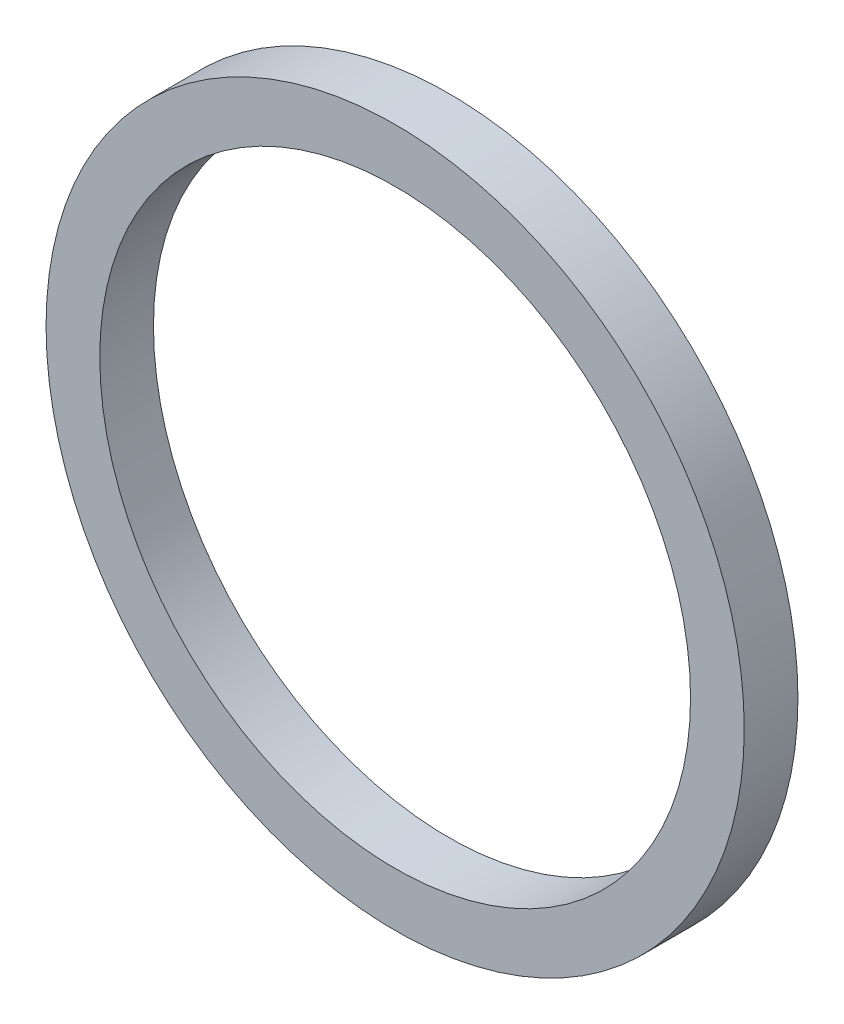
ISO-10303-21;
HEADER;
FILE_DESCRIPTION(('STEP AP214'),'2;1');
FILE_NAME('part.step','',(''),(''),'','','');
FILE_SCHEMA(('AUTOMOTIVE_DESIGN { 1 0 10303 214 1 1 1 1 }'));
ENDSEC;
DATA;
#1=APPLICATION_CONTEXT('core data for automotive mechanical design processes');
#2=APPLICATION_PROTOCOL_DEFINITION('international standard','automotive_design',2000,#1);
#3=PRODUCT_CONTEXT('',#1,'mechanical');
#4=PRODUCT('Part','Part','',(#3));
#5=PRODUCT_RELATED_PRODUCT_CATEGORY('part','',(#4));
#6=PRODUCT_DEFINITION_FORMATION('','',#4);
#7=PRODUCT_DEFINITION_CONTEXT('part definition',#1,'design');
#8=PRODUCT_DEFINITION('design','',#6,#7);
#9=PRODUCT_DEFINITION_SHAPE('','',#8);
#10=(LENGTH_UNIT() NAMED_UNIT(*) SI_UNIT(.MILLI.,.METRE.));
#11=(NAMED_UNIT(*) PLANE_ANGLE_UNIT() SI_UNIT($,.RADIAN.));
#12=(NAMED_UNIT(*) SI_UNIT($,.STERADIAN.) SOLID_ANGLE_UNIT());
#13=UNCERTAINTY_MEASURE_WITH_UNIT(LENGTH_MEASURE(1.E-05),#10,'distance_accuracy_value','');
#14=(GEOMETRIC_REPRESENTATION_CONTEXT(3) GLOBAL_UNCERTAINTY_ASSIGNED_CONTEXT((#13)) GLOBAL_UNIT_ASSIGNED_CONTEXT((#10,
#11,#12)) REPRESENTATION_CONTEXT('',''));
#15=CARTESIAN_POINT('',(0.,0.,0.));
#16=DIRECTION('',(0.,0.,1.));
#17=DIRECTION('',(1.,0.,0.));
#18=AXIS2_PLACEMENT_3D('',#15,#16,#17);
#19=CARTESIAN_POINT('',(0.,0.,2.5));
#20=DIRECTION('',(0.,0.,-1.));
#21=DIRECTION('',(-1.,0.,0.));
#22=AXIS2_PLACEMENT_3D('',#19,#20,#21);
#23=CYLINDRICAL_SURFACE('',#22,32.5);
#24=CARTESIAN_POINT('',(0.,0.,2.5));
#25=DIRECTION('',(0.,0.,1.));
#26=DIRECTION('',(1.,0.,0.));
#27=AXIS2_PLACEMENT_3D('',#24,#25,#26);
#28=CIRCLE('',#27,32.5);
#29=CARTESIAN_POINT('',(32.5,0.,2.5));
#30=VERTEX_POINT('',#29);
#31=EDGE_CURVE('E10',#30,#30,#28,.T.);
#32=ORIENTED_EDGE('',*,*,#31,.F.);
#33=EDGE_LOOP('',(#32));
#34=FACE_BOUND('',#33,.T.);
#35=CARTESIAN_POINT('',(0.,0.,-2.5));
#36=DIRECTION('',(0.,0.,1.));
#37=DIRECTION('',(1.,0.,0.));
#38=AXIS2_PLACEMENT_3D('',#35,#36,#37);
#39=CIRCLE('',#38,32.5);
#40=CARTESIAN_POINT('',(32.5,0.,-2.5));
#41=VERTEX_POINT('',#40);
#42=EDGE_CURVE('E40',#41,#41,#39,.T.);
#43=ORIENTED_EDGE('',*,*,#42,.T.);
#44=EDGE_LOOP('',(#43));
#45=FACE_BOUND('',#44,.T.);
#46=ADVANCED_FACE('F37',(#34,#45),#23,.T.);
#47=CARTESIAN_POINT('',(0.,0.,2.5));
#48=DIRECTION('',(0.,0.,1.));
#49=DIRECTION('',(1.,0.,0.));
#50=AXIS2_PLACEMENT_3D('',#47,#48,#49);
#51=PLANE('',#50);
#52=CARTESIAN_POINT('',(0.,0.,2.5));
#53=DIRECTION('',(0.,0.,1.));
#54=DIRECTION('',(1.,0.,0.));
#55=AXIS2_PLACEMENT_3D('',#52,#53,#54);
#56=CIRCLE('',#55,27.5);
#57=CARTESIAN_POINT('',(27.5,0.,2.5));
#58=VERTEX_POINT('',#57);
#59=EDGE_CURVE('E51',#58,#58,#56,.T.);
#60=ORIENTED_EDGE('',*,*,#59,.F.);
#61=EDGE_LOOP('',(#60));
#62=FACE_BOUND('',#61,.T.);
#63=ORIENTED_EDGE('',*,*,#31,.T.);
#64=EDGE_LOOP('',(#63));
#65=FACE_BOUND('',#64,.T.);
#66=ADVANCED_FACE('F68',(#62,#65),#51,.T.);
#67=CARTESIAN_POINT('',(0.,0.,-2.5));
#68=DIRECTION('',(0.,0.,1.));
#69=DIRECTION('',(1.,0.,0.));
#70=AXIS2_PLACEMENT_3D('',#67,#68,#69);
#71=PLANE('',#70);
#72=CARTESIAN_POINT('',(0.,0.,-2.5));
#73=DIRECTION('',(0.,0.,1.));
#74=DIRECTION('',(1.,0.,0.));
#75=AXIS2_PLACEMENT_3D('',#72,#73,#74);
#76=CIRCLE('',#75,27.5);
#77=CARTESIAN_POINT('',(27.5,0.,-2.5));
#78=VERTEX_POINT('',#77);
#79=EDGE_CURVE('E49',#78,#78,#76,.T.);
#80=ORIENTED_EDGE('',*,*,#79,.T.);
#81=EDGE_LOOP('',(#80));
#82=FACE_BOUND('',#81,.T.);
#83=ORIENTED_EDGE('',*,*,#42,.F.);
#84=EDGE_LOOP('',(#83));
#85=FACE_BOUND('',#84,.T.);
#86=ADVANCED_FACE('F59',(#82,#85),#71,.F.);
#87=CARTESIAN_POINT('',(0.,0.,-2.5));
#88=DIRECTION('',(0.,0.,1.));
#89=DIRECTION('',(1.,0.,0.));
#90=AXIS2_PLACEMENT_3D('',#87,#88,#89);
#91=CYLINDRICAL_SURFACE('',#90,27.5);
#92=ORIENTED_EDGE('',*,*,#79,.F.);
#93=EDGE_LOOP('',(#92));
#94=FACE_BOUND('',#93,.T.);
#95=ORIENTED_EDGE('',*,*,#59,.T.);
#96=EDGE_LOOP('',(#95));
#97=FACE_BOUND('',#96,.T.);
#98=ADVANCED_FACE('F62',(#94,#97),#91,.F.);
#99=CLOSED_SHELL('',(#46,#66,#86,#98));
#100=MANIFOLD_SOLID_BREP('B2',#99);
#101=ADVANCED_BREP_SHAPE_REPRESENTATION('',(#18,#100),#14);
#102=SHAPE_DEFINITION_REPRESENTATION(#9,#101);
ENDSEC;
END-ISO-10303-21;
